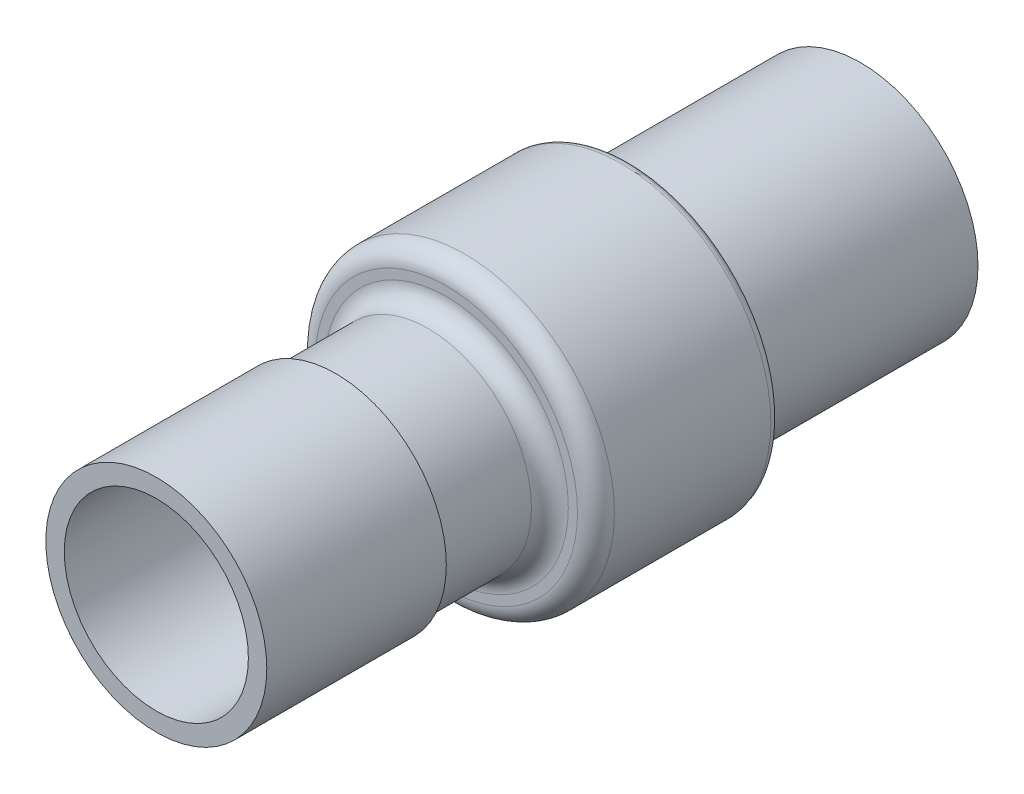
ISO-10303-21;
HEADER;
FILE_DESCRIPTION(('STEP AP214'),'2;1');
FILE_NAME('part.step','',(''),(''),'','','');
FILE_SCHEMA(('AUTOMOTIVE_DESIGN { 1 0 10303 214 1 1 1 1 }'));
ENDSEC;
DATA;
#1=APPLICATION_CONTEXT('core data for automotive mechanical design processes');
#2=APPLICATION_PROTOCOL_DEFINITION('international standard','automotive_design',2000,#1);
#3=PRODUCT_CONTEXT('',#1,'mechanical');
#4=PRODUCT('Part','Part','',(#3));
#5=PRODUCT_RELATED_PRODUCT_CATEGORY('part','',(#4));
#6=PRODUCT_DEFINITION_FORMATION('','',#4);
#7=PRODUCT_DEFINITION_CONTEXT('part definition',#1,'design');
#8=PRODUCT_DEFINITION('design','',#6,#7);
#9=PRODUCT_DEFINITION_SHAPE('','',#8);
#10=(LENGTH_UNIT() NAMED_UNIT(*) SI_UNIT(.MILLI.,.METRE.));
#11=(NAMED_UNIT(*) PLANE_ANGLE_UNIT() SI_UNIT($,.RADIAN.));
#12=(NAMED_UNIT(*) SI_UNIT($,.STERADIAN.) SOLID_ANGLE_UNIT());
#13=UNCERTAINTY_MEASURE_WITH_UNIT(LENGTH_MEASURE(1.E-05),#10,'distance_accuracy_value','');
#14=(GEOMETRIC_REPRESENTATION_CONTEXT(3) GLOBAL_UNCERTAINTY_ASSIGNED_CONTEXT((#13)) GLOBAL_UNIT_ASSIGNED_CONTEXT((#10,
#11,#12)) REPRESENTATION_CONTEXT('',''));
#15=CARTESIAN_POINT('',(0.,0.,0.));
#16=DIRECTION('',(0.,0.,1.));
#17=DIRECTION('',(1.,0.,0.));
#18=AXIS2_PLACEMENT_3D('',#15,#16,#17);
#19=CARTESIAN_POINT('',(5.,0.,0.));
#20=DIRECTION('',(0.,0.,1.));
#21=DIRECTION('',(1.,0.,0.));
#22=AXIS2_PLACEMENT_3D('',#19,#20,#21);
#23=PLANE('',#22);
#24=CARTESIAN_POINT('',(0.,0.,0.));
#25=DIRECTION('',(0.,0.,1.));
#26=DIRECTION('',(1.,0.,0.));
#27=AXIS2_PLACEMENT_3D('',#24,#25,#26);
#28=CIRCLE('',#27,10.);
#29=CARTESIAN_POINT('',(10.,0.,0.));
#30=VERTEX_POINT('',#29);
#31=EDGE_CURVE('E10',#30,#30,#28,.T.);
#32=ORIENTED_EDGE('',*,*,#31,.T.);
#33=EDGE_LOOP('',(#32));
#34=FACE_BOUND('',#33,.T.);
#35=ADVANCED_FACE('F15',(#34),#23,.T.);
#36=CARTESIAN_POINT('',(5.375,0.,-48.1364317238331));
#37=DIRECTION('',(0.,0.,-1.));
#38=DIRECTION('',(-1.,0.,0.));
#39=AXIS2_PLACEMENT_3D('',#36,#37,#38);
#40=PLANE('',#39);
#41=CARTESIAN_POINT('',(0.,0.,-48.1364317238331));
#42=DIRECTION('',(0.,0.,1.));
#43=DIRECTION('',(1.,0.,0.));
#44=AXIS2_PLACEMENT_3D('',#41,#42,#43);
#45=CIRCLE('',#44,10.75);
#46=CARTESIAN_POINT('',(10.75,0.,-48.1364317238331));
#47=VERTEX_POINT('',#46);
#48=EDGE_CURVE('E21',#47,#47,#45,.T.);
#49=ORIENTED_EDGE('',*,*,#48,.F.);
#50=EDGE_LOOP('',(#49));
#51=FACE_BOUND('',#50,.T.);
#52=ADVANCED_FACE('F87',(#51),#40,.T.);
#53=CARTESIAN_POINT('',(0.,0.,-35.0099792703986));
#54=DIRECTION('',(0.,0.,1.));
#55=DIRECTION('',(1.,0.,0.));
#56=AXIS2_PLACEMENT_3D('',#53,#54,#55);
#57=CYLINDRICAL_SURFACE('',#56,10.75);
#58=ORIENTED_EDGE('',*,*,#48,.T.);
#59=EDGE_LOOP('',(#58));
#60=FACE_BOUND('',#59,.T.);
#61=CARTESIAN_POINT('',(0.,0.,-61.5));
#62=DIRECTION('',(0.,0.,1.));
#63=DIRECTION('',(1.,0.,0.));
#64=AXIS2_PLACEMENT_3D('',#61,#62,#63);
#65=CIRCLE('',#64,10.75);
#66=CARTESIAN_POINT('',(10.75,0.,-61.5));
#67=VERTEX_POINT('',#66);
#68=EDGE_CURVE('E25',#67,#67,#65,.T.);
#69=ORIENTED_EDGE('',*,*,#68,.F.);
#70=EDGE_LOOP('',(#69));
#71=FACE_BOUND('',#70,.T.);
#72=ADVANCED_FACE('F92',(#60,#71),#57,.F.);
#73=CARTESIAN_POINT('',(11.75,0.,-61.5));
#74=DIRECTION('',(0.,0.,-1.));
#75=DIRECTION('',(-1.,0.,0.));
#76=AXIS2_PLACEMENT_3D('',#73,#74,#75);
#77=PLANE('',#76);
#78=ORIENTED_EDGE('',*,*,#68,.T.);
#79=EDGE_LOOP('',(#78));
#80=FACE_BOUND('',#79,.T.);
#81=CARTESIAN_POINT('',(0.,0.,-61.5));
#82=DIRECTION('',(0.,0.,1.));
#83=DIRECTION('',(1.,0.,0.));
#84=AXIS2_PLACEMENT_3D('',#81,#82,#83);
#85=CIRCLE('',#84,12.75);
#86=CARTESIAN_POINT('',(12.75,0.,-61.5));
#87=VERTEX_POINT('',#86);
#88=EDGE_CURVE('E29',#87,#87,#85,.T.);
#89=ORIENTED_EDGE('',*,*,#88,.F.);
#90=EDGE_LOOP('',(#89));
#91=FACE_BOUND('',#90,.T.);
#92=ADVANCED_FACE('F97',(#80,#91),#77,.T.);
#93=CARTESIAN_POINT('',(0.,0.,-35.0099792703986));
#94=DIRECTION('',(0.,0.,1.));
#95=DIRECTION('',(1.,0.,0.));
#96=AXIS2_PLACEMENT_3D('',#93,#94,#95);
#97=CYLINDRICAL_SURFACE('',#96,12.75);
#98=ORIENTED_EDGE('',*,*,#88,.T.);
#99=EDGE_LOOP('',(#98));
#100=FACE_BOUND('',#99,.T.);
#101=CARTESIAN_POINT('',(0.,0.,-36.5));
#102=DIRECTION('',(0.,0.,1.));
#103=DIRECTION('',(1.,0.,0.));
#104=AXIS2_PLACEMENT_3D('',#101,#102,#103);
#105=CIRCLE('',#104,12.75);
#106=CARTESIAN_POINT('',(12.75,0.,-36.5));
#107=VERTEX_POINT('',#106);
#108=EDGE_CURVE('E34',#107,#107,#105,.T.);
#109=ORIENTED_EDGE('',*,*,#108,.F.);
#110=EDGE_LOOP('',(#109));
#111=FACE_BOUND('',#110,.T.);
#112=ADVANCED_FACE('F102',(#100,#111),#97,.T.);
#113=CARTESIAN_POINT('',(14.5,0.,-36.5));
#114=DIRECTION('',(0.,0.,-1.));
#115=DIRECTION('',(-1.,0.,0.));
#116=AXIS2_PLACEMENT_3D('',#113,#114,#115);
#117=PLANE('',#116);
#118=CARTESIAN_POINT('',(0.,0.,-36.5));
#119=DIRECTION('',(0.,0.,-1.));
#120=DIRECTION('',(-1.,0.,0.));
#121=AXIS2_PLACEMENT_3D('',#118,#119,#120);
#122=CIRCLE('',#121,15.25);
#123=CARTESIAN_POINT('',(-15.25,0.,-36.5));
#124=VERTEX_POINT('',#123);
#125=EDGE_CURVE('E37',#124,#124,#122,.T.);
#126=ORIENTED_EDGE('',*,*,#125,.T.);
#127=EDGE_LOOP('',(#126));
#128=FACE_BOUND('',#127,.T.);
#129=ORIENTED_EDGE('',*,*,#108,.T.);
#130=EDGE_LOOP('',(#129));
#131=FACE_BOUND('',#130,.T.);
#132=ADVANCED_FACE('F106',(#128,#131),#117,.T.);
#133=CARTESIAN_POINT('',(0.,0.,-35.0099792703986));
#134=DIRECTION('',(0.,0.,1.));
#135=DIRECTION('',(1.,0.,0.));
#136=AXIS2_PLACEMENT_3D('',#133,#134,#135);
#137=CYLINDRICAL_SURFACE('',#136,16.25);
#138=CARTESIAN_POINT('',(0.,0.,-35.5));
#139=DIRECTION('',(0.,0.,-1.));
#140=DIRECTION('',(-1.,0.,0.));
#141=AXIS2_PLACEMENT_3D('',#138,#139,#140);
#142=CIRCLE('',#141,16.25);
#143=CARTESIAN_POINT('',(-16.25,0.,-35.5));
#144=VERTEX_POINT('',#143);
#145=EDGE_CURVE('E40',#144,#144,#142,.F.);
#146=ORIENTED_EDGE('',*,*,#145,.T.);
#147=EDGE_LOOP('',(#146));
#148=FACE_BOUND('',#147,.T.);
#149=CARTESIAN_POINT('',(0.,0.,-18.5));
#150=DIRECTION('',(0.,0.,1.));
#151=DIRECTION('',(1.,0.,0.));
#152=AXIS2_PLACEMENT_3D('',#149,#150,#151);
#153=CIRCLE('',#152,16.25);
#154=CARTESIAN_POINT('',(16.25,0.,-18.5));
#155=VERTEX_POINT('',#154);
#156=EDGE_CURVE('E43',#155,#155,#153,.F.);
#157=ORIENTED_EDGE('',*,*,#156,.T.);
#158=EDGE_LOOP('',(#157));
#159=FACE_BOUND('',#158,.T.);
#160=ADVANCED_FACE('F110',(#148,#159),#137,.T.);
#161=CARTESIAN_POINT('',(13.75,0.,-16.5));
#162=DIRECTION('',(0.,0.,1.));
#163=DIRECTION('',(1.,0.,0.));
#164=AXIS2_PLACEMENT_3D('',#161,#162,#163);
#165=PLANE('',#164);
#166=CARTESIAN_POINT('',(0.,0.,-16.5));
#167=DIRECTION('',(0.,0.,1.));
#168=DIRECTION('',(1.,0.,0.));
#169=AXIS2_PLACEMENT_3D('',#166,#167,#168);
#170=CIRCLE('',#169,14.25);
#171=CARTESIAN_POINT('',(14.25,0.,-16.5));
#172=VERTEX_POINT('',#171);
#173=EDGE_CURVE('E46',#172,#172,#170,.T.);
#174=ORIENTED_EDGE('',*,*,#173,.T.);
#175=EDGE_LOOP('',(#174));
#176=FACE_BOUND('',#175,.T.);
#177=CARTESIAN_POINT('',(0.,0.,-16.5));
#178=DIRECTION('',(0.,0.,1.));
#179=DIRECTION('',(1.,0.,0.));
#180=AXIS2_PLACEMENT_3D('',#177,#178,#179);
#181=CIRCLE('',#180,13.25);
#182=CARTESIAN_POINT('',(13.25,0.,-16.5));
#183=VERTEX_POINT('',#182);
#184=EDGE_CURVE('E49',#183,#183,#181,.F.);
#185=ORIENTED_EDGE('',*,*,#184,.T.);
#186=EDGE_LOOP('',(#185));
#187=FACE_BOUND('',#186,.T.);
#188=ADVANCED_FACE('F114',(#176,#187),#165,.T.);
#189=CARTESIAN_POINT('',(0.,0.,-35.0099792703986));
#190=DIRECTION('',(0.,0.,1.));
#191=DIRECTION('',(1.,0.,0.));
#192=AXIS2_PLACEMENT_3D('',#189,#190,#191);
#193=CYLINDRICAL_SURFACE('',#192,11.25);
#194=CARTESIAN_POINT('',(0.,0.,-14.5));
#195=DIRECTION('',(0.,0.,1.));
#196=DIRECTION('',(1.,0.,0.));
#197=AXIS2_PLACEMENT_3D('',#194,#195,#196);
#198=CIRCLE('',#197,11.25);
#199=CARTESIAN_POINT('',(11.25,0.,-14.5));
#200=VERTEX_POINT('',#199);
#201=EDGE_CURVE('E52',#200,#200,#198,.T.);
#202=ORIENTED_EDGE('',*,*,#201,.T.);
#203=EDGE_LOOP('',(#202));
#204=FACE_BOUND('',#203,.T.);
#205=CARTESIAN_POINT('',(0.,0.,-4.5));
#206=DIRECTION('',(0.,0.,1.));
#207=DIRECTION('',(1.,0.,0.));
#208=AXIS2_PLACEMENT_3D('',#205,#206,#207);
#209=CIRCLE('',#208,11.25);
#210=CARTESIAN_POINT('',(11.25,0.,-4.5));
#211=VERTEX_POINT('',#210);
#212=EDGE_CURVE('E55',#211,#211,#209,.T.);
#213=ORIENTED_EDGE('',*,*,#212,.F.);
#214=EDGE_LOOP('',(#213));
#215=FACE_BOUND('',#214,.T.);
#216=ADVANCED_FACE('F118',(#204,#215),#193,.T.);
#217=CARTESIAN_POINT('',(11.625,0.,-4.5));
#218=DIRECTION('',(0.,0.,-1.));
#219=DIRECTION('',(-1.,0.,0.));
#220=AXIS2_PLACEMENT_3D('',#217,#218,#219);
#221=PLANE('',#220);
#222=ORIENTED_EDGE('',*,*,#212,.T.);
#223=EDGE_LOOP('',(#222));
#224=FACE_BOUND('',#223,.T.);
#225=CARTESIAN_POINT('',(0.,0.,-4.5));
#226=DIRECTION('',(0.,0.,1.));
#227=DIRECTION('',(1.,0.,0.));
#228=AXIS2_PLACEMENT_3D('',#225,#226,#227);
#229=CIRCLE('',#228,12.);
#230=CARTESIAN_POINT('',(12.,0.,-4.5));
#231=VERTEX_POINT('',#230);
#232=EDGE_CURVE('E58',#231,#231,#229,.T.);
#233=ORIENTED_EDGE('',*,*,#232,.F.);
#234=EDGE_LOOP('',(#233));
#235=FACE_BOUND('',#234,.T.);
#236=ADVANCED_FACE('F83',(#224,#235),#221,.T.);
#237=CARTESIAN_POINT('',(0.,0.,-35.0099792703986));
#238=DIRECTION('',(0.,0.,1.));
#239=DIRECTION('',(1.,0.,0.));
#240=AXIS2_PLACEMENT_3D('',#237,#238,#239);
#241=CYLINDRICAL_SURFACE('',#240,12.);
#242=ORIENTED_EDGE('',*,*,#232,.T.);
#243=EDGE_LOOP('',(#242));
#244=FACE_BOUND('',#243,.T.);
#245=CARTESIAN_POINT('',(0.,0.,15.));
#246=DIRECTION('',(0.,0.,1.));
#247=DIRECTION('',(1.,0.,0.));
#248=AXIS2_PLACEMENT_3D('',#245,#246,#247);
#249=CIRCLE('',#248,12.);
#250=CARTESIAN_POINT('',(12.,0.,15.));
#251=VERTEX_POINT('',#250);
#252=EDGE_CURVE('E61',#251,#251,#249,.T.);
#253=ORIENTED_EDGE('',*,*,#252,.F.);
#254=EDGE_LOOP('',(#253));
#255=FACE_BOUND('',#254,.T.);
#256=ADVANCED_FACE('F73',(#244,#255),#241,.T.);
#257=CARTESIAN_POINT('',(11.,0.,15.));
#258=DIRECTION('',(0.,0.,1.));
#259=DIRECTION('',(1.,0.,0.));
#260=AXIS2_PLACEMENT_3D('',#257,#258,#259);
#261=PLANE('',#260);
#262=ORIENTED_EDGE('',*,*,#252,.T.);
#263=EDGE_LOOP('',(#262));
#264=FACE_BOUND('',#263,.T.);
#265=CARTESIAN_POINT('',(0.,0.,15.));
#266=DIRECTION('',(0.,0.,1.));
#267=DIRECTION('',(1.,0.,0.));
#268=AXIS2_PLACEMENT_3D('',#265,#266,#267);
#269=CIRCLE('',#268,10.);
#270=CARTESIAN_POINT('',(10.,0.,15.));
#271=VERTEX_POINT('',#270);
#272=EDGE_CURVE('E64',#271,#271,#269,.T.);
#273=ORIENTED_EDGE('',*,*,#272,.F.);
#274=EDGE_LOOP('',(#273));
#275=FACE_BOUND('',#274,.T.);
#276=ADVANCED_FACE('F71',(#264,#275),#261,.T.);
#277=CARTESIAN_POINT('',(0.,0.,-35.0099792703986));
#278=DIRECTION('',(0.,0.,1.));
#279=DIRECTION('',(1.,0.,0.));
#280=AXIS2_PLACEMENT_3D('',#277,#278,#279);
#281=CYLINDRICAL_SURFACE('',#280,10.);
#282=ORIENTED_EDGE('',*,*,#272,.T.);
#283=EDGE_LOOP('',(#282));
#284=FACE_BOUND('',#283,.T.);
#285=ORIENTED_EDGE('',*,*,#31,.F.);
#286=EDGE_LOOP('',(#285));
#287=FACE_BOUND('',#286,.T.);
#288=ADVANCED_FACE('F68',(#284,#287),#281,.F.);
#289=CARTESIAN_POINT('',(0.,0.,-18.5));
#290=DIRECTION('',(0.,0.,1.));
#291=DIRECTION('',(1.,0.,0.));
#292=AXIS2_PLACEMENT_3D('',#289,#290,#291);
#293=TOROIDAL_SURFACE('',#292,14.25,2.);
#294=ORIENTED_EDGE('',*,*,#156,.F.);
#295=EDGE_LOOP('',(#294));
#296=FACE_BOUND('',#295,.T.);
#297=ORIENTED_EDGE('',*,*,#173,.F.);
#298=EDGE_LOOP('',(#297));
#299=FACE_BOUND('',#298,.T.);
#300=ADVANCED_FACE('F81',(#296,#299),#293,.T.);
#301=CARTESIAN_POINT('',(0.,0.,-14.5));
#302=DIRECTION('',(0.,0.,1.));
#303=DIRECTION('',(1.,0.,0.));
#304=AXIS2_PLACEMENT_3D('',#301,#302,#303);
#305=TOROIDAL_SURFACE('',#304,13.25,2.);
#306=ORIENTED_EDGE('',*,*,#184,.F.);
#307=EDGE_LOOP('',(#306));
#308=FACE_BOUND('',#307,.T.);
#309=ORIENTED_EDGE('',*,*,#201,.F.);
#310=EDGE_LOOP('',(#309));
#311=FACE_BOUND('',#310,.T.);
#312=ADVANCED_FACE('F166',(#308,#311),#305,.F.);
#313=CARTESIAN_POINT('',(0.,0.,-35.5));
#314=DIRECTION('',(0.,0.,-1.));
#315=DIRECTION('',(-1.,0.,0.));
#316=AXIS2_PLACEMENT_3D('',#313,#314,#315);
#317=TOROIDAL_SURFACE('',#316,15.25,1.);
#318=ORIENTED_EDGE('',*,*,#125,.F.);
#319=EDGE_LOOP('',(#318));
#320=FACE_BOUND('',#319,.T.);
#321=ORIENTED_EDGE('',*,*,#145,.F.);
#322=EDGE_LOOP('',(#321));
#323=FACE_BOUND('',#322,.T.);
#324=ADVANCED_FACE('F176',(#320,#323),#317,.T.);
#325=CLOSED_SHELL('',(#35,#52,#72,#92,#112,#132,#160,#188,#216,#236,#256,#276,#288,#300,#312,#324));
#326=MANIFOLD_SOLID_BREP('B1',#325);
#327=ADVANCED_BREP_SHAPE_REPRESENTATION('',(#18,#326),#14);
#328=SHAPE_DEFINITION_REPRESENTATION(#9,#327);
ENDSEC;
END-ISO-10303-21;
